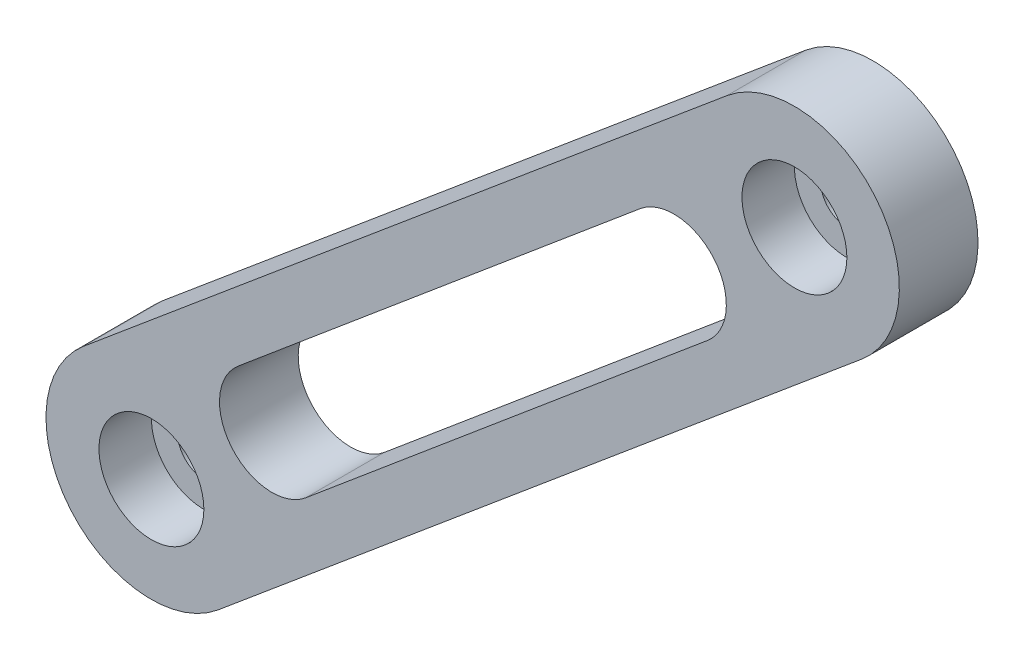
ISO-10303-21;
HEADER;
FILE_DESCRIPTION(('STEP AP214'),'2;1');
FILE_NAME('part.step','',(''),(''),'','','');
FILE_SCHEMA(('AUTOMOTIVE_DESIGN { 1 0 10303 214 1 1 1 1 }'));
ENDSEC;
DATA;
#1=APPLICATION_CONTEXT('core data for automotive mechanical design processes');
#2=APPLICATION_PROTOCOL_DEFINITION('international standard','automotive_design',2000,#1);
#3=PRODUCT_CONTEXT('',#1,'mechanical');
#4=PRODUCT('Part','Part','',(#3));
#5=PRODUCT_RELATED_PRODUCT_CATEGORY('part','',(#4));
#6=PRODUCT_DEFINITION_FORMATION('','',#4);
#7=PRODUCT_DEFINITION_CONTEXT('part definition',#1,'design');
#8=PRODUCT_DEFINITION('design','',#6,#7);
#9=PRODUCT_DEFINITION_SHAPE('','',#8);
#10=(LENGTH_UNIT() NAMED_UNIT(*) SI_UNIT(.MILLI.,.METRE.));
#11=(NAMED_UNIT(*) PLANE_ANGLE_UNIT() SI_UNIT($,.RADIAN.));
#12=(NAMED_UNIT(*) SI_UNIT($,.STERADIAN.) SOLID_ANGLE_UNIT());
#13=UNCERTAINTY_MEASURE_WITH_UNIT(LENGTH_MEASURE(1.E-05),#10,'distance_accuracy_value','');
#14=(GEOMETRIC_REPRESENTATION_CONTEXT(3) GLOBAL_UNCERTAINTY_ASSIGNED_CONTEXT((#13)) GLOBAL_UNIT_ASSIGNED_CONTEXT((#10,
#11,#12)) REPRESENTATION_CONTEXT('',''));
#15=CARTESIAN_POINT('',(0.,0.,0.));
#16=DIRECTION('',(0.,0.,1.));
#17=DIRECTION('',(1.,0.,0.));
#18=AXIS2_PLACEMENT_3D('',#15,#16,#17);
#19=CARTESIAN_POINT('',(579.3098403104,479.231908653555,19.05));
#20=DIRECTION('',(0.,0.,-1.));
#21=DIRECTION('',(-1.,0.,0.));
#22=AXIS2_PLACEMENT_3D('',#19,#20,#21);
#23=CYLINDRICAL_SURFACE('',#22,6.34999999999994);
#24=CARTESIAN_POINT('',(579.3098403104,479.231908653555,0.));
#25=DIRECTION('',(0.,0.,1.));
#26=DIRECTION('',(1.,0.,0.));
#27=AXIS2_PLACEMENT_3D('',#24,#25,#26);
#28=CIRCLE('',#27,6.34999999999994);
#29=CARTESIAN_POINT('',(572.959840310401,479.231908653555,0.));
#30=VERTEX_POINT('',#29);
#31=EDGE_CURVE('E125',#30,#30,#28,.T.);
#32=CARTESIAN_POINT('',(579.3098403104,479.231908653555,6.35));
#33=DIRECTION('',(0.,0.,1.));
#34=DIRECTION('',(1.,0.,0.));
#35=AXIS2_PLACEMENT_3D('',#32,#33,#34);
#36=CIRCLE('',#35,6.34999999999994);
#37=CARTESIAN_POINT('',(572.959840310401,479.231908653555,6.35));
#38=VERTEX_POINT('',#37);
#39=EDGE_CURVE('E43',#38,#38,#36,.T.);
#40=CARTESIAN_POINT('',(572.959840310401,479.231908653555,0.));
#41=CARTESIAN_POINT('',(572.959840310401,479.231908653555,0.0661458333333329));
#42=CARTESIAN_POINT('',(572.959840310401,479.231908653555,0.132291666666666));
#43=CARTESIAN_POINT('',(572.959840310401,479.231908653555,0.264583333333333));
#44=CARTESIAN_POINT('',(572.959840310401,479.231908653555,0.330729166666667));
#45=CARTESIAN_POINT('',(572.959840310401,479.231908653555,0.463020833333334));
#46=CARTESIAN_POINT('',(572.959840310401,479.231908653555,0.529166666666667));
#47=CARTESIAN_POINT('',(572.959840310401,479.231908653555,0.661458333333333));
#48=CARTESIAN_POINT('',(572.959840310401,479.231908653555,0.727604166666666));
#49=CARTESIAN_POINT('',(572.959840310401,479.231908653555,0.859895833333334));
#50=CARTESIAN_POINT('',(572.959840310401,479.231908653555,0.926041666666668));
#51=CARTESIAN_POINT('',(572.959840310401,479.231908653555,1.05833333333333));
#52=CARTESIAN_POINT('',(572.959840310401,479.231908653555,1.12447916666667));
#53=CARTESIAN_POINT('',(572.959840310401,479.231908653555,1.25677083333333));
#54=CARTESIAN_POINT('',(572.959840310401,479.231908653555,1.32291666666667));
#55=CARTESIAN_POINT('',(572.959840310401,479.231908653555,1.45520833333333));
#56=CARTESIAN_POINT('',(572.959840310401,479.231908653555,1.52135416666667));
#57=CARTESIAN_POINT('',(572.959840310401,479.231908653555,1.65364583333333));
#58=CARTESIAN_POINT('',(572.959840310401,479.231908653555,1.71979166666667));
#59=CARTESIAN_POINT('',(572.959840310401,479.231908653555,1.85208333333333));
#60=CARTESIAN_POINT('',(572.959840310401,479.231908653555,1.91822916666667));
#61=CARTESIAN_POINT('',(572.959840310401,479.231908653555,2.05052083333333));
#62=CARTESIAN_POINT('',(572.959840310401,479.231908653555,2.11666666666667));
#63=CARTESIAN_POINT('',(572.959840310401,479.231908653555,2.24895833333333));
#64=CARTESIAN_POINT('',(572.959840310401,479.231908653555,2.31510416666667));
#65=CARTESIAN_POINT('',(572.959840310401,479.231908653555,2.44739583333333));
#66=CARTESIAN_POINT('',(572.959840310401,479.231908653555,2.51354166666667));
#67=CARTESIAN_POINT('',(572.959840310401,479.231908653555,2.64583333333333));
#68=CARTESIAN_POINT('',(572.959840310401,479.231908653555,2.71197916666667));
#69=CARTESIAN_POINT('',(572.959840310401,479.231908653555,2.84427083333333));
#70=CARTESIAN_POINT('',(572.959840310401,479.231908653555,2.91041666666667));
#71=CARTESIAN_POINT('',(572.959840310401,479.231908653555,3.04270833333333));
#72=CARTESIAN_POINT('',(572.959840310401,479.231908653555,3.10885416666667));
#73=CARTESIAN_POINT('',(572.959840310401,479.231908653555,3.24114583333333));
#74=CARTESIAN_POINT('',(572.959840310401,479.231908653555,3.30729166666667));
#75=CARTESIAN_POINT('',(572.959840310401,479.231908653555,3.43958333333333));
#76=CARTESIAN_POINT('',(572.959840310401,479.231908653555,3.50572916666667));
#77=CARTESIAN_POINT('',(572.959840310401,479.231908653555,3.63802083333333));
#78=CARTESIAN_POINT('',(572.959840310401,479.231908653555,3.70416666666667));
#79=CARTESIAN_POINT('',(572.959840310401,479.231908653555,3.83645833333333));
#80=CARTESIAN_POINT('',(572.959840310401,479.231908653555,3.90260416666667));
#81=CARTESIAN_POINT('',(572.959840310401,479.231908653555,4.03489583333333));
#82=CARTESIAN_POINT('',(572.959840310401,479.231908653555,4.10104166666667));
#83=CARTESIAN_POINT('',(572.959840310401,479.231908653555,4.23333333333333));
#84=CARTESIAN_POINT('',(572.959840310401,479.231908653555,4.29947916666667));
#85=CARTESIAN_POINT('',(572.959840310401,479.231908653555,4.43177083333333));
#86=CARTESIAN_POINT('',(572.959840310401,479.231908653555,4.49791666666667));
#87=CARTESIAN_POINT('',(572.959840310401,479.231908653555,4.63020833333333));
#88=CARTESIAN_POINT('',(572.959840310401,479.231908653555,4.69635416666667));
#89=CARTESIAN_POINT('',(572.959840310401,479.231908653555,4.82864583333333));
#90=CARTESIAN_POINT('',(572.959840310401,479.231908653555,4.89479166666667));
#91=CARTESIAN_POINT('',(572.959840310401,479.231908653555,5.02708333333333));
#92=CARTESIAN_POINT('',(572.959840310401,479.231908653555,5.09322916666667));
#93=CARTESIAN_POINT('',(572.959840310401,479.231908653555,5.22552083333333));
#94=CARTESIAN_POINT('',(572.959840310401,479.231908653555,5.29166666666667));
#95=CARTESIAN_POINT('',(572.959840310401,479.231908653555,5.42395833333333));
#96=CARTESIAN_POINT('',(572.959840310401,479.231908653555,5.49010416666667));
#97=CARTESIAN_POINT('',(572.959840310401,479.231908653555,5.62239583333333));
#98=CARTESIAN_POINT('',(572.959840310401,479.231908653555,5.68854166666667));
#99=CARTESIAN_POINT('',(572.959840310401,479.231908653555,5.82083333333333));
#100=CARTESIAN_POINT('',(572.959840310401,479.231908653555,5.88697916666667));
#101=CARTESIAN_POINT('',(572.959840310401,479.231908653555,6.01927083333333));
#102=CARTESIAN_POINT('',(572.959840310401,479.231908653555,6.08541666666667));
#103=CARTESIAN_POINT('',(572.959840310401,479.231908653555,6.21770833333333));
#104=CARTESIAN_POINT('',(572.959840310401,479.231908653555,6.28385416666667));
#105=CARTESIAN_POINT('',(572.959840310401,479.231908653555,6.35));
#106=B_SPLINE_CURVE_WITH_KNOTS('',3,(#40,#41,#42,#43,#44,#45,#46,#47,#48,#49,#50,#51,#52,#53,
#54,#55,#56,#57,#58,#59,#60,#61,#62,#63,#64,#65,#66,#67,#68,#69,#70,#71,#72,#73,#74,#75,#76,#77,
#78,#79,#80,#81,#82,#83,#84,#85,#86,#87,#88,#89,#90,#91,#92,#93,#94,#95,#96,#97,#98,#99,#100,
#101,#102,#103,#104,#105),.UNSPECIFIED.,.F.,.F.,(4,2,2,2,2,2,2,2,2,2,2,2,2,2,2,2,2,2,2,2,2,2,2,
2,2,2,2,2,2,2,2,2,4),(0.,0.198437499999999,0.396875000000001,0.5953125,0.793749999999999,
0.992187500000002,1.190625,1.3890625,1.5875,1.7859375,1.984375,2.1828125,2.38125,2.5796875,
2.778125,2.9765625,3.175,3.3734375,3.571875,3.7703125,3.96875,4.1671875,4.365625,4.5640625,
4.7625,4.9609375,5.159375,5.3578125,5.55625,5.7546875,5.953125,6.1515625,6.35),.UNSPECIFIED.);
#107=EDGE_CURVE('BSEAM39',#30,#38,#106,.T.);
#108=ORIENTED_EDGE('',*,*,#31,.F.);
#109=ORIENTED_EDGE('',*,*,#39,.T.);
#110=ORIENTED_EDGE('',*,*,#107,.T.);
#111=ORIENTED_EDGE('',*,*,#107,.F.);
#112=EDGE_LOOP('',(#108,#110,#109,#111));
#113=FACE_BOUND('',#112,.T.);
#114=ADVANCED_FACE('F39',(#113),#23,.F.);
#115=CARTESIAN_POINT('',(423.649859524732,348.617676187237,19.05));
#116=DIRECTION('',(0.,0.,-1.));
#117=DIRECTION('',(-1.,0.,0.));
#118=AXIS2_PLACEMENT_3D('',#115,#116,#117);
#119=CYLINDRICAL_SURFACE('',#118,6.34999999999994);
#120=CARTESIAN_POINT('',(423.649859524732,348.617676187237,0.));
#121=DIRECTION('',(0.,0.,1.));
#122=DIRECTION('',(1.,0.,0.));
#123=AXIS2_PLACEMENT_3D('',#120,#121,#122);
#124=CIRCLE('',#123,6.34999999999994);
#125=CARTESIAN_POINT('',(417.299859524732,348.617676187237,0.));
#126=VERTEX_POINT('',#125);
#127=EDGE_CURVE('E143',#126,#126,#124,.T.);
#128=CARTESIAN_POINT('',(423.649859524732,348.617676187237,6.35));
#129=DIRECTION('',(0.,0.,1.));
#130=DIRECTION('',(1.,0.,0.));
#131=AXIS2_PLACEMENT_3D('',#128,#129,#130);
#132=CIRCLE('',#131,6.34999999999994);
#133=CARTESIAN_POINT('',(417.299859524732,348.617676187237,6.35));
#134=VERTEX_POINT('',#133);
#135=EDGE_CURVE('E198',#134,#134,#132,.T.);
#136=CARTESIAN_POINT('',(417.299859524732,348.617676187237,0.));
#137=CARTESIAN_POINT('',(417.299859524732,348.617676187237,0.0661458333333329));
#138=CARTESIAN_POINT('',(417.299859524732,348.617676187237,0.132291666666666));
#139=CARTESIAN_POINT('',(417.299859524732,348.617676187237,0.264583333333333));
#140=CARTESIAN_POINT('',(417.299859524732,348.617676187237,0.330729166666667));
#141=CARTESIAN_POINT('',(417.299859524732,348.617676187237,0.463020833333334));
#142=CARTESIAN_POINT('',(417.299859524732,348.617676187237,0.529166666666667));
#143=CARTESIAN_POINT('',(417.299859524732,348.617676187237,0.661458333333333));
#144=CARTESIAN_POINT('',(417.299859524732,348.617676187237,0.727604166666666));
#145=CARTESIAN_POINT('',(417.299859524732,348.617676187237,0.859895833333334));
#146=CARTESIAN_POINT('',(417.299859524732,348.617676187237,0.926041666666668));
#147=CARTESIAN_POINT('',(417.299859524732,348.617676187237,1.05833333333333));
#148=CARTESIAN_POINT('',(417.299859524732,348.617676187237,1.12447916666667));
#149=CARTESIAN_POINT('',(417.299859524732,348.617676187237,1.25677083333333));
#150=CARTESIAN_POINT('',(417.299859524732,348.617676187237,1.32291666666667));
#151=CARTESIAN_POINT('',(417.299859524732,348.617676187237,1.45520833333333));
#152=CARTESIAN_POINT('',(417.299859524732,348.617676187237,1.52135416666667));
#153=CARTESIAN_POINT('',(417.299859524732,348.617676187237,1.65364583333333));
#154=CARTESIAN_POINT('',(417.299859524732,348.617676187237,1.71979166666667));
#155=CARTESIAN_POINT('',(417.299859524732,348.617676187237,1.85208333333333));
#156=CARTESIAN_POINT('',(417.299859524732,348.617676187237,1.91822916666667));
#157=CARTESIAN_POINT('',(417.299859524732,348.617676187237,2.05052083333333));
#158=CARTESIAN_POINT('',(417.299859524732,348.617676187237,2.11666666666667));
#159=CARTESIAN_POINT('',(417.299859524732,348.617676187237,2.24895833333333));
#160=CARTESIAN_POINT('',(417.299859524732,348.617676187237,2.31510416666667));
#161=CARTESIAN_POINT('',(417.299859524732,348.617676187237,2.44739583333333));
#162=CARTESIAN_POINT('',(417.299859524732,348.617676187237,2.51354166666667));
#163=CARTESIAN_POINT('',(417.299859524732,348.617676187237,2.64583333333333));
#164=CARTESIAN_POINT('',(417.299859524732,348.617676187237,2.71197916666667));
#165=CARTESIAN_POINT('',(417.299859524732,348.617676187237,2.84427083333333));
#166=CARTESIAN_POINT('',(417.299859524732,348.617676187237,2.91041666666667));
#167=CARTESIAN_POINT('',(417.299859524732,348.617676187237,3.04270833333333));
#168=CARTESIAN_POINT('',(417.299859524732,348.617676187237,3.10885416666667));
#169=CARTESIAN_POINT('',(417.299859524732,348.617676187237,3.24114583333333));
#170=CARTESIAN_POINT('',(417.299859524732,348.617676187237,3.30729166666667));
#171=CARTESIAN_POINT('',(417.299859524732,348.617676187237,3.43958333333333));
#172=CARTESIAN_POINT('',(417.299859524732,348.617676187237,3.50572916666667));
#173=CARTESIAN_POINT('',(417.299859524732,348.617676187237,3.63802083333333));
#174=CARTESIAN_POINT('',(417.299859524732,348.617676187237,3.70416666666667));
#175=CARTESIAN_POINT('',(417.299859524732,348.617676187237,3.83645833333333));
#176=CARTESIAN_POINT('',(417.299859524732,348.617676187237,3.90260416666667));
#177=CARTESIAN_POINT('',(417.299859524732,348.617676187237,4.03489583333333));
#178=CARTESIAN_POINT('',(417.299859524732,348.617676187237,4.10104166666667));
#179=CARTESIAN_POINT('',(417.299859524732,348.617676187237,4.23333333333333));
#180=CARTESIAN_POINT('',(417.299859524732,348.617676187237,4.29947916666667));
#181=CARTESIAN_POINT('',(417.299859524732,348.617676187237,4.43177083333333));
#182=CARTESIAN_POINT('',(417.299859524732,348.617676187237,4.49791666666667));
#183=CARTESIAN_POINT('',(417.299859524732,348.617676187237,4.63020833333333));
#184=CARTESIAN_POINT('',(417.299859524732,348.617676187237,4.69635416666667));
#185=CARTESIAN_POINT('',(417.299859524732,348.617676187237,4.82864583333333));
#186=CARTESIAN_POINT('',(417.299859524732,348.617676187237,4.89479166666667));
#187=CARTESIAN_POINT('',(417.299859524732,348.617676187237,5.02708333333333));
#188=CARTESIAN_POINT('',(417.299859524732,348.617676187237,5.09322916666667));
#189=CARTESIAN_POINT('',(417.299859524732,348.617676187237,5.22552083333333));
#190=CARTESIAN_POINT('',(417.299859524732,348.617676187237,5.29166666666667));
#191=CARTESIAN_POINT('',(417.299859524732,348.617676187237,5.42395833333333));
#192=CARTESIAN_POINT('',(417.299859524732,348.617676187237,5.49010416666667));
#193=CARTESIAN_POINT('',(417.299859524732,348.617676187237,5.62239583333333));
#194=CARTESIAN_POINT('',(417.299859524732,348.617676187237,5.68854166666667));
#195=CARTESIAN_POINT('',(417.299859524732,348.617676187237,5.82083333333333));
#196=CARTESIAN_POINT('',(417.299859524732,348.617676187237,5.88697916666667));
#197=CARTESIAN_POINT('',(417.299859524732,348.617676187237,6.01927083333333));
#198=CARTESIAN_POINT('',(417.299859524732,348.617676187237,6.08541666666667));
#199=CARTESIAN_POINT('',(417.299859524732,348.617676187237,6.21770833333333));
#200=CARTESIAN_POINT('',(417.299859524732,348.617676187237,6.28385416666667));
#201=CARTESIAN_POINT('',(417.299859524732,348.617676187237,6.35));
#202=B_SPLINE_CURVE_WITH_KNOTS('',3,(#136,#137,#138,#139,#140,#141,#142,#143,#144,#145,#146,
#147,#148,#149,#150,#151,#152,#153,#154,#155,#156,#157,#158,#159,#160,#161,#162,#163,#164,#165,
#166,#167,#168,#169,#170,#171,#172,#173,#174,#175,#176,#177,#178,#179,#180,#181,#182,#183,#184,
#185,#186,#187,#188,#189,#190,#191,#192,#193,#194,#195,#196,#197,#198,#199,#200,#201),
.UNSPECIFIED.,.F.,.F.,(4,2,2,2,2,2,2,2,2,2,2,2,2,2,2,2,2,2,2,2,2,2,2,2,2,2,2,2,2,2,2,2,4),(0.,
0.198437499999999,0.396875000000001,0.5953125,0.793749999999999,0.992187500000002,1.190625,
1.3890625,1.5875,1.7859375,1.984375,2.1828125,2.38125,2.5796875,2.778125,2.9765625,3.175,
3.3734375,3.571875,3.7703125,3.96875,4.1671875,4.365625,4.5640625,4.7625,4.9609375,5.159375,
5.3578125,5.55625,5.7546875,5.953125,6.1515625,6.35),.UNSPECIFIED.);
#203=EDGE_CURVE('BSEAM229',#126,#134,#202,.T.);
#204=ORIENTED_EDGE('',*,*,#127,.F.);
#205=ORIENTED_EDGE('',*,*,#135,.T.);
#206=ORIENTED_EDGE('',*,*,#203,.T.);
#207=ORIENTED_EDGE('',*,*,#203,.F.);
#208=EDGE_LOOP('',(#204,#206,#205,#207));
#209=FACE_BOUND('',#208,.T.);
#210=ADVANCED_FACE('F229',(#209),#119,.F.);
#211=CARTESIAN_POINT('',(423.521412938186,348.771062225499,19.05));
#212=DIRECTION('',(0.,0.,1.));
#213=DIRECTION('',(1.,0.,0.));
#214=AXIS2_PLACEMENT_3D('',#211,#212,#213);
#215=PLANE('',#214);
#216=CARTESIAN_POINT('',(423.649859524732,348.617676187237,19.05));
#217=DIRECTION('',(0.,0.,1.));
#218=DIRECTION('',(1.,0.,0.));
#219=AXIS2_PLACEMENT_3D('',#216,#217,#218);
#220=CIRCLE('',#219,12.7);
#221=CARTESIAN_POINT('',(436.349859524732,348.617676187237,19.05));
#222=VERTEX_POINT('',#221);
#223=EDGE_CURVE('E208',#222,#222,#220,.T.);
#224=ORIENTED_EDGE('',*,*,#223,.F.);
#225=EDGE_LOOP('',(#224));
#226=FACE_BOUND('',#225,.T.);
#227=CARTESIAN_POINT('',(579.3098403104,479.231908653555,19.05));
#228=DIRECTION('',(0.,0.,1.));
#229=DIRECTION('',(1.,0.,0.));
#230=AXIS2_PLACEMENT_3D('',#227,#228,#229);
#231=CIRCLE('',#230,12.6999999999999);
#232=CARTESIAN_POINT('',(592.0098403104,479.231908653555,19.05));
#233=VERTEX_POINT('',#232);
#234=EDGE_CURVE('E220',#233,#233,#231,.T.);
#235=ORIENTED_EDGE('',*,*,#234,.F.);
#236=EDGE_LOOP('',(#235));
#237=FACE_BOUND('',#236,.T.);
#238=DIRECTION('',(-0.766044443118974,-0.642787609686543,0.));
#239=VECTOR('',#238,1.);
#240=CARTESIAN_POINT('',(541.960144384548,464.470465152109,19.05));
#241=LINE('',#240,#239);
#242=CARTESIAN_POINT('',(541.960144384548,464.470465152109,19.05));
#243=VERTEX_POINT('',#242);
#244=CARTESIAN_POINT('',(444.672500108438,382.836438721918,19.05));
#245=VERTEX_POINT('',#244);
#246=EDGE_CURVE('E116',#243,#245,#241,.T.);
#247=ORIENTED_EDGE('',*,*,#246,.F.);
#248=CARTESIAN_POINT('',(550.123547027567,454.741700724497,19.05));
#249=DIRECTION('',(0.,0.,1.));
#250=DIRECTION('',(1.,0.,0.));
#251=AXIS2_PLACEMENT_3D('',#248,#249,#250);
#252=CIRCLE('',#251,12.7000000000001);
#253=CARTESIAN_POINT('',(558.286949670586,445.012936296886,19.05));
#254=VERTEX_POINT('',#253);
#255=EDGE_CURVE('E107',#254,#243,#252,.T.);
#256=ORIENTED_EDGE('',*,*,#255,.F.);
#257=DIRECTION('',(0.766044443118978,0.64278760968654,0.));
#258=VECTOR('',#257,1.);
#259=CARTESIAN_POINT('',(558.286949670586,445.012936296886,19.05));
#260=LINE('',#259,#258);
#261=CARTESIAN_POINT('',(460.999305394476,363.378909866696,19.05));
#262=VERTEX_POINT('',#261);
#263=EDGE_CURVE('E135',#262,#254,#260,.T.);
#264=ORIENTED_EDGE('',*,*,#263,.F.);
#265=CARTESIAN_POINT('',(452.835902751457,373.107674294307,19.05));
#266=DIRECTION('',(0.,0.,1.));
#267=DIRECTION('',(1.,0.,0.));
#268=AXIS2_PLACEMENT_3D('',#265,#266,#267);
#269=CIRCLE('',#268,12.6999999999998);
#270=EDGE_CURVE('E131',#245,#262,#269,.T.);
#271=ORIENTED_EDGE('',*,*,#270,.F.);
#272=EDGE_LOOP('',(#247,#256,#264,#271));
#273=FACE_BOUND('',#272,.T.);
#274=CARTESIAN_POINT('',(423.521412938186,348.771062225499,19.05));
#275=DIRECTION('',(0.,0.,1.));
#276=DIRECTION('',(1.,0.,0.));
#277=AXIS2_PLACEMENT_3D('',#274,#275,#276);
#278=CIRCLE('',#277,25.4000000000002);
#279=CARTESIAN_POINT('',(407.213769987931,368.244654123426,19.05));
#280=VERTEX_POINT('',#279);
#281=CARTESIAN_POINT('',(439.829052993137,329.297467902977,19.05));
#282=VERTEX_POINT('',#281);
#283=EDGE_CURVE('E163',#280,#282,#278,.T.);
#284=ORIENTED_EDGE('',*,*,#283,.T.);
#285=DIRECTION('',(0.766676941831591,0.642033073029543,0.));
#286=VECTOR('',#285,1.);
#287=CARTESIAN_POINT('',(595.617480365351,459.758314331032,19.05));
#288=LINE('',#287,#286);
#289=CARTESIAN_POINT('',(595.617480365351,459.758314331032,19.05));
#290=VERTEX_POINT('',#289);
#291=EDGE_CURVE('E167',#282,#290,#288,.T.);
#292=ORIENTED_EDGE('',*,*,#291,.T.);
#293=CARTESIAN_POINT('',(579.3098403104,479.231908653555,19.05));
#294=DIRECTION('',(0.,0.,1.));
#295=DIRECTION('',(-1.,0.,0.));
#296=AXIS2_PLACEMENT_3D('',#293,#294,#295);
#297=CIRCLE('',#296,25.4000000000001);
#298=CARTESIAN_POINT('',(563.00220025545,498.705502976077,19.05));
#299=VERTEX_POINT('',#298);
#300=EDGE_CURVE('E171',#290,#299,#297,.T.);
#301=ORIENTED_EDGE('',*,*,#300,.T.);
#302=DIRECTION('',(-0.766676941831591,-0.642033073029543,0.));
#303=VECTOR('',#302,1.);
#304=CARTESIAN_POINT('',(563.00220025545,498.705502976077,19.05));
#305=LINE('',#304,#303);
#306=EDGE_CURVE('E174',#299,#280,#305,.T.);
#307=ORIENTED_EDGE('',*,*,#306,.T.);
#308=EDGE_LOOP('',(#284,#292,#301,#307));
#309=FACE_BOUND('',#308,.T.);
#310=ADVANCED_FACE('F129',(#226,#237,#273,#309),#215,.T.);
#311=CARTESIAN_POINT('',(423.521412938186,348.771062225499,0.));
#312=DIRECTION('',(0.,0.,1.));
#313=DIRECTION('',(1.,0.,0.));
#314=AXIS2_PLACEMENT_3D('',#311,#312,#313);
#315=PLANE('',#314);
#316=ORIENTED_EDGE('',*,*,#31,.T.);
#317=EDGE_LOOP('',(#316));
#318=FACE_BOUND('',#317,.T.);
#319=CARTESIAN_POINT('',(423.521412938186,348.771062225499,0.));
#320=DIRECTION('',(0.,0.,1.));
#321=DIRECTION('',(1.,0.,0.));
#322=AXIS2_PLACEMENT_3D('',#319,#320,#321);
#323=CIRCLE('',#322,25.4000000000002);
#324=CARTESIAN_POINT('',(407.213769987931,368.244654123426,0.));
#325=VERTEX_POINT('',#324);
#326=CARTESIAN_POINT('',(439.829052993137,329.297467902977,0.));
#327=VERTEX_POINT('',#326);
#328=EDGE_CURVE('E162',#325,#327,#323,.T.);
#329=ORIENTED_EDGE('',*,*,#328,.F.);
#330=DIRECTION('',(-0.766676941831591,-0.642033073029543,0.));
#331=VECTOR('',#330,1.);
#332=CARTESIAN_POINT('',(563.00220025545,498.705502976077,0.));
#333=LINE('',#332,#331);
#334=CARTESIAN_POINT('',(563.00220025545,498.705502976077,0.));
#335=VERTEX_POINT('',#334);
#336=EDGE_CURVE('E168',#335,#325,#333,.T.);
#337=ORIENTED_EDGE('',*,*,#336,.F.);
#338=CARTESIAN_POINT('',(579.3098403104,479.231908653555,0.));
#339=DIRECTION('',(0.,0.,1.));
#340=DIRECTION('',(-1.,0.,0.));
#341=AXIS2_PLACEMENT_3D('',#338,#339,#340);
#342=CIRCLE('',#341,25.4000000000001);
#343=CARTESIAN_POINT('',(595.617480365351,459.758314331032,0.));
#344=VERTEX_POINT('',#343);
#345=EDGE_CURVE('E184',#344,#335,#342,.T.);
#346=ORIENTED_EDGE('',*,*,#345,.F.);
#347=DIRECTION('',(0.766676941831591,0.642033073029543,0.));
#348=VECTOR('',#347,1.);
#349=CARTESIAN_POINT('',(595.617480365351,459.758314331032,0.));
#350=LINE('',#349,#348);
#351=EDGE_CURVE('E181',#327,#344,#350,.T.);
#352=ORIENTED_EDGE('',*,*,#351,.F.);
#353=EDGE_LOOP('',(#329,#337,#346,#352));
#354=FACE_BOUND('',#353,.T.);
#355=CARTESIAN_POINT('',(550.123547027567,454.741700724497,0.));
#356=DIRECTION('',(0.,0.,1.));
#357=DIRECTION('',(1.,0.,0.));
#358=AXIS2_PLACEMENT_3D('',#355,#356,#357);
#359=CIRCLE('',#358,12.7000000000001);
#360=CARTESIAN_POINT('',(558.286949670586,445.012936296886,0.));
#361=VERTEX_POINT('',#360);
#362=CARTESIAN_POINT('',(541.960144384548,464.470465152109,0.));
#363=VERTEX_POINT('',#362);
#364=EDGE_CURVE('E65',#361,#363,#359,.T.);
#365=ORIENTED_EDGE('',*,*,#364,.T.);
#366=DIRECTION('',(-0.766044443118974,-0.642787609686543,0.));
#367=VECTOR('',#366,1.);
#368=CARTESIAN_POINT('',(541.960144384548,464.470465152109,0.));
#369=LINE('',#368,#367);
#370=CARTESIAN_POINT('',(444.672500108438,382.836438721918,0.));
#371=VERTEX_POINT('',#370);
#372=EDGE_CURVE('E123',#363,#371,#369,.T.);
#373=ORIENTED_EDGE('',*,*,#372,.T.);
#374=CARTESIAN_POINT('',(452.835902751457,373.107674294307,0.));
#375=DIRECTION('',(0.,0.,1.));
#376=DIRECTION('',(1.,0.,0.));
#377=AXIS2_PLACEMENT_3D('',#374,#375,#376);
#378=CIRCLE('',#377,12.6999999999998);
#379=CARTESIAN_POINT('',(460.999305394476,363.378909866696,0.));
#380=VERTEX_POINT('',#379);
#381=EDGE_CURVE('E146',#371,#380,#378,.T.);
#382=ORIENTED_EDGE('',*,*,#381,.T.);
#383=DIRECTION('',(0.766044443118978,0.64278760968654,0.));
#384=VECTOR('',#383,1.);
#385=CARTESIAN_POINT('',(558.286949670586,445.012936296886,0.));
#386=LINE('',#385,#384);
#387=EDGE_CURVE('E117',#380,#361,#386,.T.);
#388=ORIENTED_EDGE('',*,*,#387,.T.);
#389=EDGE_LOOP('',(#365,#373,#382,#388));
#390=FACE_BOUND('',#389,.T.);
#391=ORIENTED_EDGE('',*,*,#127,.T.);
#392=EDGE_LOOP('',(#391));
#393=FACE_BOUND('',#392,.T.);
#394=ADVANCED_FACE('F227',(#318,#354,#390,#393),#315,.F.);
#395=CARTESIAN_POINT('',(423.521412938186,348.771062225499,19.05));
#396=DIRECTION('',(0.,0.,-1.));
#397=DIRECTION('',(-1.,0.,0.));
#398=AXIS2_PLACEMENT_3D('',#395,#396,#397);
#399=CYLINDRICAL_SURFACE('',#398,25.4000000000002);
#400=ORIENTED_EDGE('',*,*,#328,.T.);
#401=DIRECTION('',(0.,0.,-1.));
#402=VECTOR('',#401,1.);
#403=CARTESIAN_POINT('',(439.829052993137,329.297467902977,19.05));
#404=LINE('',#403,#402);
#405=EDGE_CURVE('E11',#282,#327,#404,.T.);
#406=ORIENTED_EDGE('',*,*,#405,.F.);
#407=ORIENTED_EDGE('',*,*,#283,.F.);
#408=DIRECTION('',(0.,0.,-1.));
#409=VECTOR('',#408,1.);
#410=CARTESIAN_POINT('',(407.213769987931,368.244654123426,19.05));
#411=LINE('',#410,#409);
#412=EDGE_CURVE('E177',#280,#325,#411,.T.);
#413=ORIENTED_EDGE('',*,*,#412,.T.);
#414=EDGE_LOOP('',(#400,#406,#407,#413));
#415=FACE_BOUND('',#414,.T.);
#416=ADVANCED_FACE('F41',(#415),#399,.T.);
#417=CARTESIAN_POINT('',(595.617480365351,459.758314331032,19.05));
#418=DIRECTION('',(-0.642033073029543,0.766676941831591,0.));
#419=DIRECTION('',(-0.766676941831591,-0.642033073029543,0.));
#420=AXIS2_PLACEMENT_3D('',#417,#418,#419);
#421=PLANE('',#420);
#422=ORIENTED_EDGE('',*,*,#351,.T.);
#423=DIRECTION('',(0.,0.,-1.));
#424=VECTOR('',#423,1.);
#425=CARTESIAN_POINT('',(595.617480365351,459.758314331032,19.05));
#426=LINE('',#425,#424);
#427=EDGE_CURVE('E49',#290,#344,#426,.T.);
#428=ORIENTED_EDGE('',*,*,#427,.F.);
#429=ORIENTED_EDGE('',*,*,#291,.F.);
#430=ORIENTED_EDGE('',*,*,#405,.T.);
#431=EDGE_LOOP('',(#422,#428,#429,#430));
#432=FACE_BOUND('',#431,.T.);
#433=ADVANCED_FACE('F265',(#432),#421,.F.);
#434=CARTESIAN_POINT('',(579.3098403104,479.231908653555,19.05));
#435=DIRECTION('',(0.,0.,-1.));
#436=DIRECTION('',(-1.,0.,0.));
#437=AXIS2_PLACEMENT_3D('',#434,#435,#436);
#438=CYLINDRICAL_SURFACE('',#437,25.4000000000001);
#439=ORIENTED_EDGE('',*,*,#345,.T.);
#440=DIRECTION('',(0.,0.,-1.));
#441=VECTOR('',#440,1.);
#442=CARTESIAN_POINT('',(563.00220025545,498.705502976077,19.05));
#443=LINE('',#442,#441);
#444=EDGE_CURVE('E192',#299,#335,#443,.T.);
#445=ORIENTED_EDGE('',*,*,#444,.F.);
#446=ORIENTED_EDGE('',*,*,#300,.F.);
#447=ORIENTED_EDGE('',*,*,#427,.T.);
#448=EDGE_LOOP('',(#439,#445,#446,#447));
#449=FACE_BOUND('',#448,.T.);
#450=ADVANCED_FACE('F262',(#449),#438,.T.);
#451=CARTESIAN_POINT('',(563.00220025545,498.705502976077,19.05));
#452=DIRECTION('',(0.642033073029543,-0.766676941831591,0.));
#453=DIRECTION('',(0.766676941831591,0.642033073029543,0.));
#454=AXIS2_PLACEMENT_3D('',#451,#452,#453);
#455=PLANE('',#454);
#456=ORIENTED_EDGE('',*,*,#336,.T.);
#457=ORIENTED_EDGE('',*,*,#412,.F.);
#458=ORIENTED_EDGE('',*,*,#306,.F.);
#459=ORIENTED_EDGE('',*,*,#444,.T.);
#460=EDGE_LOOP('',(#456,#457,#458,#459));
#461=FACE_BOUND('',#460,.T.);
#462=ADVANCED_FACE('F255',(#461),#455,.F.);
#463=CARTESIAN_POINT('',(550.123547027567,454.741700724497,19.05));
#464=DIRECTION('',(0.,0.,-1.));
#465=DIRECTION('',(-1.,0.,0.));
#466=AXIS2_PLACEMENT_3D('',#463,#464,#465);
#467=CYLINDRICAL_SURFACE('',#466,12.7000000000001);
#468=ORIENTED_EDGE('',*,*,#364,.F.);
#469=DIRECTION('',(0.,0.,-1.));
#470=VECTOR('',#469,1.);
#471=CARTESIAN_POINT('',(558.286949670586,445.012936296886,19.05));
#472=LINE('',#471,#470);
#473=EDGE_CURVE('E111',#254,#361,#472,.T.);
#474=ORIENTED_EDGE('',*,*,#473,.F.);
#475=ORIENTED_EDGE('',*,*,#255,.T.);
#476=DIRECTION('',(0.,0.,-1.));
#477=VECTOR('',#476,1.);
#478=CARTESIAN_POINT('',(541.960144384548,464.470465152109,19.05));
#479=LINE('',#478,#477);
#480=EDGE_CURVE('E110',#243,#363,#479,.T.);
#481=ORIENTED_EDGE('',*,*,#480,.T.);
#482=EDGE_LOOP('',(#468,#474,#475,#481));
#483=FACE_BOUND('',#482,.T.);
#484=ADVANCED_FACE('F109',(#483),#467,.F.);
#485=CARTESIAN_POINT('',(541.960144384548,464.470465152109,19.05));
#486=DIRECTION('',(0.642787609686544,-0.766044443118975,0.));
#487=DIRECTION('',(0.766044443118974,0.642787609686543,0.));
#488=AXIS2_PLACEMENT_3D('',#485,#486,#487);
#489=PLANE('',#488);
#490=ORIENTED_EDGE('',*,*,#372,.F.);
#491=ORIENTED_EDGE('',*,*,#480,.F.);
#492=ORIENTED_EDGE('',*,*,#246,.T.);
#493=DIRECTION('',(0.,0.,-1.));
#494=VECTOR('',#493,1.);
#495=CARTESIAN_POINT('',(444.672500108438,382.836438721918,19.05));
#496=LINE('',#495,#494);
#497=EDGE_CURVE('E126',#245,#371,#496,.T.);
#498=ORIENTED_EDGE('',*,*,#497,.T.);
#499=EDGE_LOOP('',(#490,#491,#492,#498));
#500=FACE_BOUND('',#499,.T.);
#501=ADVANCED_FACE('F120',(#500),#489,.T.);
#502=CARTESIAN_POINT('',(452.835902751457,373.107674294307,19.05));
#503=DIRECTION('',(0.,0.,-1.));
#504=DIRECTION('',(-1.,0.,0.));
#505=AXIS2_PLACEMENT_3D('',#502,#503,#504);
#506=CYLINDRICAL_SURFACE('',#505,12.6999999999998);
#507=ORIENTED_EDGE('',*,*,#381,.F.);
#508=ORIENTED_EDGE('',*,*,#497,.F.);
#509=ORIENTED_EDGE('',*,*,#270,.T.);
#510=DIRECTION('',(0.,0.,-1.));
#511=VECTOR('',#510,1.);
#512=CARTESIAN_POINT('',(460.999305394476,363.378909866696,19.05));
#513=LINE('',#512,#511);
#514=EDGE_CURVE('E57',#262,#380,#513,.T.);
#515=ORIENTED_EDGE('',*,*,#514,.T.);
#516=EDGE_LOOP('',(#507,#508,#509,#515));
#517=FACE_BOUND('',#516,.T.);
#518=ADVANCED_FACE('F248',(#517),#506,.F.);
#519=CARTESIAN_POINT('',(558.286949670586,445.012936296886,19.05));
#520=DIRECTION('',(-0.64278760968654,0.766044443118978,0.));
#521=DIRECTION('',(-0.766044443118978,-0.64278760968654,0.));
#522=AXIS2_PLACEMENT_3D('',#519,#520,#521);
#523=PLANE('',#522);
#524=ORIENTED_EDGE('',*,*,#387,.F.);
#525=ORIENTED_EDGE('',*,*,#514,.F.);
#526=ORIENTED_EDGE('',*,*,#263,.T.);
#527=ORIENTED_EDGE('',*,*,#473,.T.);
#528=EDGE_LOOP('',(#524,#525,#526,#527));
#529=FACE_BOUND('',#528,.T.);
#530=ADVANCED_FACE('F244',(#529),#523,.T.);
#531=CARTESIAN_POINT('',(423.649859524732,348.617676187237,6.35));
#532=DIRECTION('',(0.,0.,1.));
#533=DIRECTION('',(1.,0.,0.));
#534=AXIS2_PLACEMENT_3D('',#531,#532,#533);
#535=CYLINDRICAL_SURFACE('',#534,12.7);
#536=CARTESIAN_POINT('',(423.649859524732,348.617676187237,6.35));
#537=DIRECTION('',(0.,0.,1.));
#538=DIRECTION('',(1.,0.,0.));
#539=AXIS2_PLACEMENT_3D('',#536,#537,#538);
#540=CIRCLE('',#539,12.7);
#541=CARTESIAN_POINT('',(436.349859524732,348.617676187237,6.35));
#542=VERTEX_POINT('',#541);
#543=EDGE_CURVE('E201',#542,#542,#540,.T.);
#544=ORIENTED_EDGE('',*,*,#543,.F.);
#545=EDGE_LOOP('',(#544));
#546=FACE_BOUND('',#545,.T.);
#547=ORIENTED_EDGE('',*,*,#223,.T.);
#548=EDGE_LOOP('',(#547));
#549=FACE_BOUND('',#548,.T.);
#550=ADVANCED_FACE('F247',(#546,#549),#535,.F.);
#551=CARTESIAN_POINT('',(423.649859524732,348.617676187237,6.35));
#552=DIRECTION('',(0.,0.,1.));
#553=DIRECTION('',(1.,0.,0.));
#554=AXIS2_PLACEMENT_3D('',#551,#552,#553);
#555=PLANE('',#554);
#556=ORIENTED_EDGE('',*,*,#135,.F.);
#557=EDGE_LOOP('',(#556));
#558=FACE_BOUND('',#557,.T.);
#559=ORIENTED_EDGE('',*,*,#543,.T.);
#560=EDGE_LOOP('',(#559));
#561=FACE_BOUND('',#560,.T.);
#562=ADVANCED_FACE('F308',(#558,#561),#555,.T.);
#563=CARTESIAN_POINT('',(579.3098403104,479.231908653555,6.35));
#564=DIRECTION('',(0.,0.,1.));
#565=DIRECTION('',(1.,0.,0.));
#566=AXIS2_PLACEMENT_3D('',#563,#564,#565);
#567=CYLINDRICAL_SURFACE('',#566,12.6999999999999);
#568=CARTESIAN_POINT('',(579.3098403104,479.231908653555,6.35));
#569=DIRECTION('',(0.,0.,1.));
#570=DIRECTION('',(1.,0.,0.));
#571=AXIS2_PLACEMENT_3D('',#568,#569,#570);
#572=CIRCLE('',#571,12.6999999999999);
#573=CARTESIAN_POINT('',(592.0098403104,479.231908653555,6.35));
#574=VERTEX_POINT('',#573);
#575=EDGE_CURVE('E214',#574,#574,#572,.T.);
#576=ORIENTED_EDGE('',*,*,#575,.F.);
#577=EDGE_LOOP('',(#576));
#578=FACE_BOUND('',#577,.T.);
#579=ORIENTED_EDGE('',*,*,#234,.T.);
#580=EDGE_LOOP('',(#579));
#581=FACE_BOUND('',#580,.T.);
#582=ADVANCED_FACE('F242',(#578,#581),#567,.F.);
#583=CARTESIAN_POINT('',(579.3098403104,479.231908653555,6.35));
#584=DIRECTION('',(0.,0.,1.));
#585=DIRECTION('',(1.,0.,0.));
#586=AXIS2_PLACEMENT_3D('',#583,#584,#585);
#587=PLANE('',#586);
#588=ORIENTED_EDGE('',*,*,#39,.F.);
#589=EDGE_LOOP('',(#588));
#590=FACE_BOUND('',#589,.T.);
#591=ORIENTED_EDGE('',*,*,#575,.T.);
#592=EDGE_LOOP('',(#591));
#593=FACE_BOUND('',#592,.T.);
#594=ADVANCED_FACE('F328',(#590,#593),#587,.T.);
#595=CLOSED_SHELL('',(#114,#210,#310,#394,#416,#433,#450,#462,#484,#501,#518,#530,#550,#562,
#582,#594));
#596=MANIFOLD_SOLID_BREP('B2',#595);
#597=ADVANCED_BREP_SHAPE_REPRESENTATION('',(#18,#596),#14);
#598=SHAPE_DEFINITION_REPRESENTATION(#9,#597);
ENDSEC;
END-ISO-10303-21;
